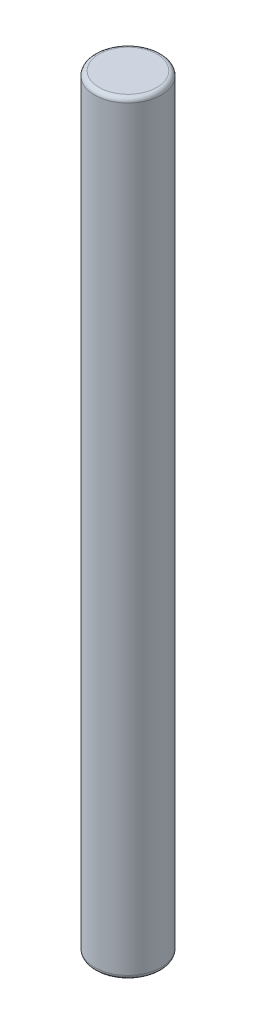
ISO-10303-21;
HEADER;
FILE_DESCRIPTION(('STEP AP214'),'2;1');
FILE_NAME('part.step','',(''),(''),'','','');
FILE_SCHEMA(('AUTOMOTIVE_DESIGN { 1 0 10303 214 1 1 1 1 }'));
ENDSEC;
DATA;
#1=APPLICATION_CONTEXT('core data for automotive mechanical design processes');
#2=APPLICATION_PROTOCOL_DEFINITION('international standard','automotive_design',2000,#1);
#3=PRODUCT_CONTEXT('',#1,'mechanical');
#4=PRODUCT('Part','Part','',(#3));
#5=PRODUCT_RELATED_PRODUCT_CATEGORY('part','',(#4));
#6=PRODUCT_DEFINITION_FORMATION('','',#4);
#7=PRODUCT_DEFINITION_CONTEXT('part definition',#1,'design');
#8=PRODUCT_DEFINITION('design','',#6,#7);
#9=PRODUCT_DEFINITION_SHAPE('','',#8);
#10=(LENGTH_UNIT() NAMED_UNIT(*) SI_UNIT(.MILLI.,.METRE.));
#11=(NAMED_UNIT(*) PLANE_ANGLE_UNIT() SI_UNIT($,.RADIAN.));
#12=(NAMED_UNIT(*) SI_UNIT($,.STERADIAN.) SOLID_ANGLE_UNIT());
#13=UNCERTAINTY_MEASURE_WITH_UNIT(LENGTH_MEASURE(1.E-05),#10,'distance_accuracy_value','');
#14=(GEOMETRIC_REPRESENTATION_CONTEXT(3) GLOBAL_UNCERTAINTY_ASSIGNED_CONTEXT((#13)) GLOBAL_UNIT_ASSIGNED_CONTEXT((#10,
#11,#12)) REPRESENTATION_CONTEXT('',''));
#15=CARTESIAN_POINT('',(0.,0.,0.));
#16=DIRECTION('',(0.,0.,1.));
#17=DIRECTION('',(1.,0.,0.));
#18=AXIS2_PLACEMENT_3D('',#15,#16,#17);
#19=CARTESIAN_POINT('',(0.,172.,0.));
#20=DIRECTION('',(0.,-1.,0.));
#21=DIRECTION('',(0.,0.,-1.));
#22=AXIS2_PLACEMENT_3D('',#19,#20,#21);
#23=CYLINDRICAL_SURFACE('',#22,7.5);
#24=CARTESIAN_POINT('',(0.,1.,0.));
#25=DIRECTION('',(0.,1.,0.));
#26=DIRECTION('',(0.,0.,1.));
#27=AXIS2_PLACEMENT_3D('',#24,#25,#26);
#28=CIRCLE('',#27,7.5);
#29=CARTESIAN_POINT('',(0.,1.,7.5));
#30=VERTEX_POINT('',#29);
#31=EDGE_CURVE('E56',#30,#30,#28,.T.);
#32=ORIENTED_EDGE('',*,*,#31,.T.);
#33=EDGE_LOOP('',(#32));
#34=FACE_BOUND('',#33,.T.);
#35=CARTESIAN_POINT('',(0.,171.,0.));
#36=DIRECTION('',(0.,1.,0.));
#37=DIRECTION('',(0.,0.,1.));
#38=AXIS2_PLACEMENT_3D('',#35,#36,#37);
#39=CIRCLE('',#38,7.5);
#40=CARTESIAN_POINT('',(0.,171.,7.5));
#41=VERTEX_POINT('',#40);
#42=EDGE_CURVE('E61',#41,#41,#39,.F.);
#43=ORIENTED_EDGE('',*,*,#42,.T.);
#44=EDGE_LOOP('',(#43));
#45=FACE_BOUND('',#44,.T.);
#46=ADVANCED_FACE('F43',(#34,#45),#23,.T.);
#47=CARTESIAN_POINT('',(0.,172.,0.));
#48=DIRECTION('',(0.,1.,0.));
#49=DIRECTION('',(0.,0.,1.));
#50=AXIS2_PLACEMENT_3D('',#47,#48,#49);
#51=PLANE('',#50);
#52=CARTESIAN_POINT('',(0.,172.,0.));
#53=DIRECTION('',(0.,1.,0.));
#54=DIRECTION('',(0.,0.,1.));
#55=AXIS2_PLACEMENT_3D('',#52,#53,#54);
#56=CIRCLE('',#55,6.5);
#57=CARTESIAN_POINT('',(0.,172.,6.5));
#58=VERTEX_POINT('',#57);
#59=EDGE_CURVE('E10',#58,#58,#56,.T.);
#60=ORIENTED_EDGE('',*,*,#59,.T.);
#61=EDGE_LOOP('',(#60));
#62=FACE_BOUND('',#61,.T.);
#63=ADVANCED_FACE('F78',(#62),#51,.T.);
#64=CARTESIAN_POINT('',(0.,0.,0.));
#65=DIRECTION('',(0.,1.,0.));
#66=DIRECTION('',(0.,0.,1.));
#67=AXIS2_PLACEMENT_3D('',#64,#65,#66);
#68=PLANE('',#67);
#69=CARTESIAN_POINT('',(0.,0.,0.));
#70=DIRECTION('',(0.,1.,0.));
#71=DIRECTION('',(0.,0.,1.));
#72=AXIS2_PLACEMENT_3D('',#69,#70,#71);
#73=CIRCLE('',#72,6.5);
#74=CARTESIAN_POINT('',(0.,0.,6.5));
#75=VERTEX_POINT('',#74);
#76=EDGE_CURVE('E51',#75,#75,#73,.F.);
#77=ORIENTED_EDGE('',*,*,#76,.T.);
#78=EDGE_LOOP('',(#77));
#79=FACE_BOUND('',#78,.T.);
#80=ADVANCED_FACE('F75',(#79),#68,.F.);
#81=CARTESIAN_POINT('',(0.,1.,0.));
#82=DIRECTION('',(0.,1.,0.));
#83=DIRECTION('',(0.,0.,1.));
#84=AXIS2_PLACEMENT_3D('',#81,#82,#83);
#85=TOROIDAL_SURFACE('',#84,6.5,1.);
#86=ORIENTED_EDGE('',*,*,#76,.F.);
#87=EDGE_LOOP('',(#86));
#88=FACE_BOUND('',#87,.T.);
#89=ORIENTED_EDGE('',*,*,#31,.F.);
#90=EDGE_LOOP('',(#89));
#91=FACE_BOUND('',#90,.T.);
#92=ADVANCED_FACE('F71',(#88,#91),#85,.T.);
#93=CARTESIAN_POINT('',(0.,171.,0.));
#94=DIRECTION('',(0.,1.,0.));
#95=DIRECTION('',(0.,0.,1.));
#96=AXIS2_PLACEMENT_3D('',#93,#94,#95);
#97=TOROIDAL_SURFACE('',#96,6.5,1.);
#98=ORIENTED_EDGE('',*,*,#42,.F.);
#99=EDGE_LOOP('',(#98));
#100=FACE_BOUND('',#99,.T.);
#101=ORIENTED_EDGE('',*,*,#59,.F.);
#102=EDGE_LOOP('',(#101));
#103=FACE_BOUND('',#102,.T.);
#104=ADVANCED_FACE('F45',(#100,#103),#97,.T.);
#105=CLOSED_SHELL('',(#46,#63,#80,#92,#104));
#106=MANIFOLD_SOLID_BREP('B2',#105);
#107=ADVANCED_BREP_SHAPE_REPRESENTATION('',(#18,#106),#14);
#108=SHAPE_DEFINITION_REPRESENTATION(#9,#107);
ENDSEC;
END-ISO-10303-21;
